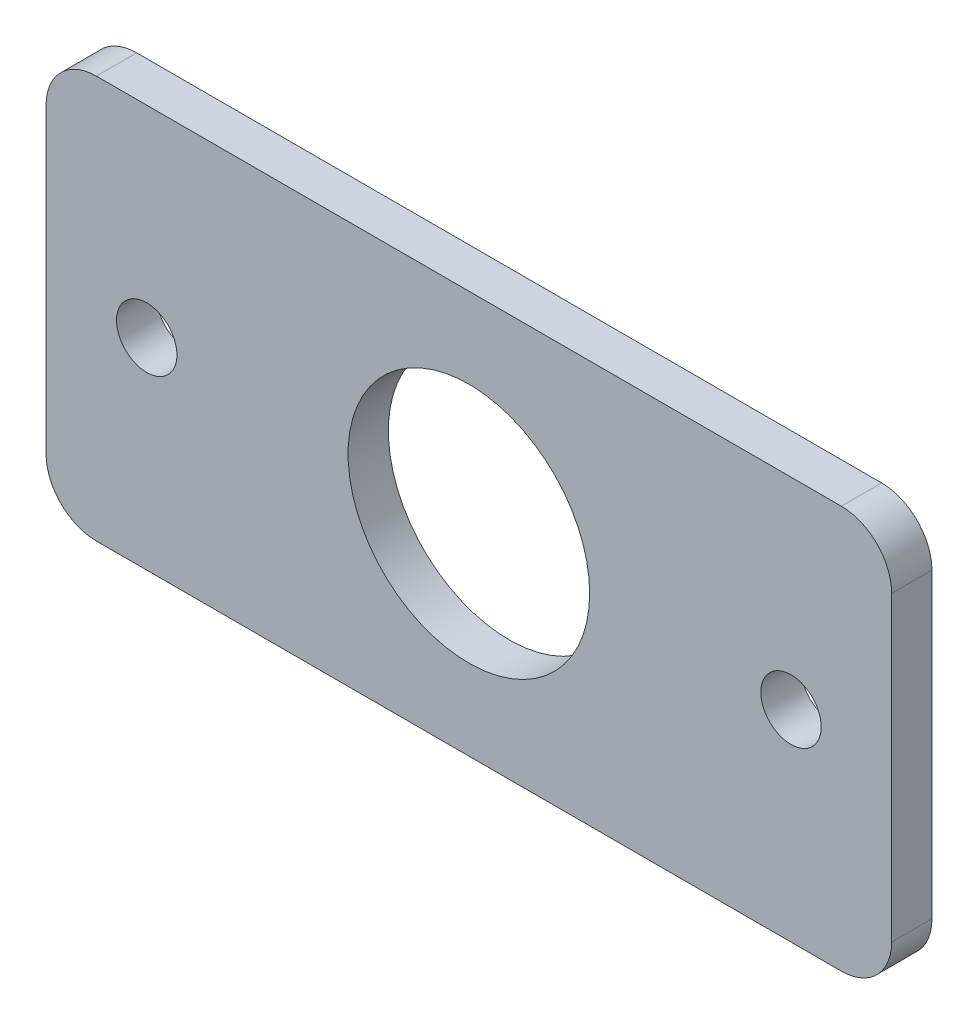
ISO-10303-21;
HEADER;
FILE_DESCRIPTION(('STEP AP214'),'2;1');
FILE_NAME('part.step','',(''),(''),'','','');
FILE_SCHEMA(('AUTOMOTIVE_DESIGN { 1 0 10303 214 1 1 1 1 }'));
ENDSEC;
DATA;
#1=APPLICATION_CONTEXT('core data for automotive mechanical design processes');
#2=APPLICATION_PROTOCOL_DEFINITION('international standard','automotive_design',2000,#1);
#3=PRODUCT_CONTEXT('',#1,'mechanical');
#4=PRODUCT('Part','Part','',(#3));
#5=PRODUCT_RELATED_PRODUCT_CATEGORY('part','',(#4));
#6=PRODUCT_DEFINITION_FORMATION('','',#4);
#7=PRODUCT_DEFINITION_CONTEXT('part definition',#1,'design');
#8=PRODUCT_DEFINITION('design','',#6,#7);
#9=PRODUCT_DEFINITION_SHAPE('','',#8);
#10=(LENGTH_UNIT() NAMED_UNIT(*) SI_UNIT(.MILLI.,.METRE.));
#11=(NAMED_UNIT(*) PLANE_ANGLE_UNIT() SI_UNIT($,.RADIAN.));
#12=(NAMED_UNIT(*) SI_UNIT($,.STERADIAN.) SOLID_ANGLE_UNIT());
#13=UNCERTAINTY_MEASURE_WITH_UNIT(LENGTH_MEASURE(1.E-05),#10,'distance_accuracy_value','');
#14=(GEOMETRIC_REPRESENTATION_CONTEXT(3) GLOBAL_UNCERTAINTY_ASSIGNED_CONTEXT((#13)) GLOBAL_UNIT_ASSIGNED_CONTEXT((#10,
#11,#12)) REPRESENTATION_CONTEXT('',''));
#15=CARTESIAN_POINT('',(0.,0.,0.));
#16=DIRECTION('',(0.,0.,1.));
#17=DIRECTION('',(1.,0.,0.));
#18=AXIS2_PLACEMENT_3D('',#15,#16,#17);
#19=CARTESIAN_POINT('',(-18.5,2.5,2.));
#20=DIRECTION('',(0.,0.,1.));
#21=DIRECTION('',(1.,0.,0.));
#22=AXIS2_PLACEMENT_3D('',#19,#20,#21);
#23=PLANE('',#22);
#24=CARTESIAN_POINT('',(-16.,10.,2.));
#25=DIRECTION('',(0.,0.,1.));
#26=DIRECTION('',(-1.,0.,0.));
#27=AXIS2_PLACEMENT_3D('',#24,#25,#26);
#28=CIRCLE('',#27,1.5);
#29=CARTESIAN_POINT('',(-17.5,10.,2.));
#30=VERTEX_POINT('',#29);
#31=EDGE_CURVE('E182',#30,#30,#28,.T.);
#32=ORIENTED_EDGE('',*,*,#31,.F.);
#33=EDGE_LOOP('',(#32));
#34=FACE_BOUND('',#33,.T.);
#35=CARTESIAN_POINT('',(-18.5,2.5,2.));
#36=DIRECTION('',(0.,0.,1.));
#37=DIRECTION('',(1.,0.,0.));
#38=AXIS2_PLACEMENT_3D('',#35,#36,#37);
#39=CIRCLE('',#38,2.5);
#40=CARTESIAN_POINT('',(-21.,2.5,2.));
#41=VERTEX_POINT('',#40);
#42=CARTESIAN_POINT('',(-18.5,0.,2.));
#43=VERTEX_POINT('',#42);
#44=EDGE_CURVE('E145',#41,#43,#39,.T.);
#45=ORIENTED_EDGE('',*,*,#44,.T.);
#46=DIRECTION('',(1.,0.,0.));
#47=VECTOR('',#46,1.);
#48=CARTESIAN_POINT('',(-18.5,0.,2.));
#49=LINE('',#48,#47);
#50=CARTESIAN_POINT('',(18.5,0.,2.));
#51=VERTEX_POINT('',#50);
#52=EDGE_CURVE('E93',#43,#51,#49,.T.);
#53=ORIENTED_EDGE('',*,*,#52,.T.);
#54=CARTESIAN_POINT('',(18.5,2.5,2.));
#55=DIRECTION('',(0.,0.,1.));
#56=DIRECTION('',(1.,0.,0.));
#57=AXIS2_PLACEMENT_3D('',#54,#55,#56);
#58=CIRCLE('',#57,2.5);
#59=CARTESIAN_POINT('',(21.,2.5,2.));
#60=VERTEX_POINT('',#59);
#61=EDGE_CURVE('E160',#51,#60,#58,.T.);
#62=ORIENTED_EDGE('',*,*,#61,.T.);
#63=DIRECTION('',(0.,1.,0.));
#64=VECTOR('',#63,1.);
#65=CARTESIAN_POINT('',(21.,17.5,2.));
#66=LINE('',#65,#64);
#67=CARTESIAN_POINT('',(21.,17.5,2.));
#68=VERTEX_POINT('',#67);
#69=EDGE_CURVE('E173',#60,#68,#66,.T.);
#70=ORIENTED_EDGE('',*,*,#69,.T.);
#71=CARTESIAN_POINT('',(18.5,17.5,2.));
#72=DIRECTION('',(0.,0.,1.));
#73=DIRECTION('',(1.,0.,0.));
#74=AXIS2_PLACEMENT_3D('',#71,#72,#73);
#75=CIRCLE('',#74,2.5);
#76=CARTESIAN_POINT('',(18.5,20.,2.));
#77=VERTEX_POINT('',#76);
#78=EDGE_CURVE('E112',#68,#77,#75,.T.);
#79=ORIENTED_EDGE('',*,*,#78,.T.);
#80=DIRECTION('',(-1.,0.,0.));
#81=VECTOR('',#80,1.);
#82=CARTESIAN_POINT('',(-18.5,20.,2.));
#83=LINE('',#82,#81);
#84=CARTESIAN_POINT('',(-18.5,20.,2.));
#85=VERTEX_POINT('',#84);
#86=EDGE_CURVE('E106',#77,#85,#83,.T.);
#87=ORIENTED_EDGE('',*,*,#86,.T.);
#88=CARTESIAN_POINT('',(-18.5,17.5,2.));
#89=DIRECTION('',(0.,0.,1.));
#90=DIRECTION('',(1.,0.,0.));
#91=AXIS2_PLACEMENT_3D('',#88,#89,#90);
#92=CIRCLE('',#91,2.5);
#93=CARTESIAN_POINT('',(-21.,17.5,2.));
#94=VERTEX_POINT('',#93);
#95=EDGE_CURVE('E110',#85,#94,#92,.T.);
#96=ORIENTED_EDGE('',*,*,#95,.T.);
#97=DIRECTION('',(0.,-1.,0.));
#98=VECTOR('',#97,1.);
#99=CARTESIAN_POINT('',(-21.,17.5,2.));
#100=LINE('',#99,#98);
#101=EDGE_CURVE('E50',#94,#41,#100,.T.);
#102=ORIENTED_EDGE('',*,*,#101,.T.);
#103=EDGE_LOOP('',(#45,#53,#62,#70,#79,#87,#96,#102));
#104=FACE_BOUND('',#103,.T.);
#105=CARTESIAN_POINT('',(16.,10.,2.));
#106=DIRECTION('',(0.,0.,1.));
#107=DIRECTION('',(1.,0.,0.));
#108=AXIS2_PLACEMENT_3D('',#105,#106,#107);
#109=CIRCLE('',#108,1.5);
#110=CARTESIAN_POINT('',(17.5,10.,2.));
#111=VERTEX_POINT('',#110);
#112=EDGE_CURVE('E134',#111,#111,#109,.T.);
#113=ORIENTED_EDGE('',*,*,#112,.F.);
#114=EDGE_LOOP('',(#113));
#115=FACE_BOUND('',#114,.T.);
#116=CARTESIAN_POINT('',(0.,10.,2.));
#117=DIRECTION('',(0.,0.,1.));
#118=DIRECTION('',(1.,0.,0.));
#119=AXIS2_PLACEMENT_3D('',#116,#117,#118);
#120=CIRCLE('',#119,6.);
#121=CARTESIAN_POINT('',(6.,10.,2.));
#122=VERTEX_POINT('',#121);
#123=EDGE_CURVE('E188',#122,#122,#120,.T.);
#124=ORIENTED_EDGE('',*,*,#123,.F.);
#125=EDGE_LOOP('',(#124));
#126=FACE_BOUND('',#125,.T.);
#127=ADVANCED_FACE('F33',(#34,#104,#115,#126),#23,.T.);
#128=CARTESIAN_POINT('',(-18.5,2.5,0.));
#129=DIRECTION('',(0.,0.,1.));
#130=DIRECTION('',(1.,0.,0.));
#131=AXIS2_PLACEMENT_3D('',#128,#129,#130);
#132=PLANE('',#131);
#133=CARTESIAN_POINT('',(-18.5,2.5,0.));
#134=DIRECTION('',(0.,0.,1.));
#135=DIRECTION('',(1.,0.,0.));
#136=AXIS2_PLACEMENT_3D('',#133,#134,#135);
#137=CIRCLE('',#136,2.5);
#138=CARTESIAN_POINT('',(-21.,2.5,0.));
#139=VERTEX_POINT('',#138);
#140=CARTESIAN_POINT('',(-18.5,0.,0.));
#141=VERTEX_POINT('',#140);
#142=EDGE_CURVE('E130',#139,#141,#137,.T.);
#143=ORIENTED_EDGE('',*,*,#142,.F.);
#144=DIRECTION('',(0.,-1.,0.));
#145=VECTOR('',#144,1.);
#146=CARTESIAN_POINT('',(-21.,17.5,0.));
#147=LINE('',#146,#145);
#148=CARTESIAN_POINT('',(-21.,17.5,0.));
#149=VERTEX_POINT('',#148);
#150=EDGE_CURVE('E85',#149,#139,#147,.T.);
#151=ORIENTED_EDGE('',*,*,#150,.F.);
#152=CARTESIAN_POINT('',(-18.5,17.5,0.));
#153=DIRECTION('',(0.,0.,1.));
#154=DIRECTION('',(1.,0.,0.));
#155=AXIS2_PLACEMENT_3D('',#152,#153,#154);
#156=CIRCLE('',#155,2.5);
#157=CARTESIAN_POINT('',(-18.5,20.,0.));
#158=VERTEX_POINT('',#157);
#159=EDGE_CURVE('E79',#158,#149,#156,.T.);
#160=ORIENTED_EDGE('',*,*,#159,.F.);
#161=DIRECTION('',(-1.,0.,0.));
#162=VECTOR('',#161,1.);
#163=CARTESIAN_POINT('',(-18.5,20.,0.));
#164=LINE('',#163,#162);
#165=CARTESIAN_POINT('',(18.5,20.,0.));
#166=VERTEX_POINT('',#165);
#167=EDGE_CURVE('E120',#166,#158,#164,.T.);
#168=ORIENTED_EDGE('',*,*,#167,.F.);
#169=CARTESIAN_POINT('',(18.5,17.5,0.));
#170=DIRECTION('',(0.,0.,1.));
#171=DIRECTION('',(1.,0.,0.));
#172=AXIS2_PLACEMENT_3D('',#169,#170,#171);
#173=CIRCLE('',#172,2.5);
#174=CARTESIAN_POINT('',(21.,17.5,0.));
#175=VERTEX_POINT('',#174);
#176=EDGE_CURVE('E140',#175,#166,#173,.T.);
#177=ORIENTED_EDGE('',*,*,#176,.F.);
#178=DIRECTION('',(0.,1.,0.));
#179=VECTOR('',#178,1.);
#180=CARTESIAN_POINT('',(21.,17.5,0.));
#181=LINE('',#180,#179);
#182=CARTESIAN_POINT('',(21.,2.5,0.));
#183=VERTEX_POINT('',#182);
#184=EDGE_CURVE('E138',#183,#175,#181,.T.);
#185=ORIENTED_EDGE('',*,*,#184,.F.);
#186=CARTESIAN_POINT('',(18.5,2.5,0.));
#187=DIRECTION('',(0.,0.,1.));
#188=DIRECTION('',(1.,0.,0.));
#189=AXIS2_PLACEMENT_3D('',#186,#187,#188);
#190=CIRCLE('',#189,2.5);
#191=CARTESIAN_POINT('',(18.5,0.,0.));
#192=VERTEX_POINT('',#191);
#193=EDGE_CURVE('E136',#192,#183,#190,.T.);
#194=ORIENTED_EDGE('',*,*,#193,.F.);
#195=DIRECTION('',(1.,0.,0.));
#196=VECTOR('',#195,1.);
#197=CARTESIAN_POINT('',(-18.5,0.,0.));
#198=LINE('',#197,#196);
#199=EDGE_CURVE('E133',#141,#192,#198,.T.);
#200=ORIENTED_EDGE('',*,*,#199,.F.);
#201=EDGE_LOOP('',(#143,#151,#160,#168,#177,#185,#194,#200));
#202=FACE_BOUND('',#201,.T.);
#203=CARTESIAN_POINT('',(16.,10.,0.));
#204=DIRECTION('',(0.,0.,1.));
#205=DIRECTION('',(1.,0.,0.));
#206=AXIS2_PLACEMENT_3D('',#203,#204,#205);
#207=CIRCLE('',#206,1.5);
#208=CARTESIAN_POINT('',(17.5,10.,0.));
#209=VERTEX_POINT('',#208);
#210=EDGE_CURVE('E179',#209,#209,#207,.T.);
#211=ORIENTED_EDGE('',*,*,#210,.T.);
#212=EDGE_LOOP('',(#211));
#213=FACE_BOUND('',#212,.T.);
#214=CARTESIAN_POINT('',(-16.,10.,0.));
#215=DIRECTION('',(0.,0.,1.));
#216=DIRECTION('',(-1.,0.,0.));
#217=AXIS2_PLACEMENT_3D('',#214,#215,#216);
#218=CIRCLE('',#217,1.5);
#219=CARTESIAN_POINT('',(-17.5,10.,0.));
#220=VERTEX_POINT('',#219);
#221=EDGE_CURVE('E185',#220,#220,#218,.T.);
#222=ORIENTED_EDGE('',*,*,#221,.T.);
#223=EDGE_LOOP('',(#222));
#224=FACE_BOUND('',#223,.T.);
#225=CARTESIAN_POINT('',(0.,10.,0.));
#226=DIRECTION('',(0.,0.,1.));
#227=DIRECTION('',(1.,0.,0.));
#228=AXIS2_PLACEMENT_3D('',#225,#226,#227);
#229=CIRCLE('',#228,6.);
#230=CARTESIAN_POINT('',(6.,10.,0.));
#231=VERTEX_POINT('',#230);
#232=EDGE_CURVE('E191',#231,#231,#229,.T.);
#233=ORIENTED_EDGE('',*,*,#232,.T.);
#234=EDGE_LOOP('',(#233));
#235=FACE_BOUND('',#234,.T.);
#236=ADVANCED_FACE('F164',(#202,#213,#224,#235),#132,.F.);
#237=CARTESIAN_POINT('',(-18.5,2.5,2.));
#238=DIRECTION('',(0.,0.,-1.));
#239=DIRECTION('',(-1.,0.,0.));
#240=AXIS2_PLACEMENT_3D('',#237,#238,#239);
#241=CYLINDRICAL_SURFACE('',#240,2.5);
#242=ORIENTED_EDGE('',*,*,#142,.T.);
#243=DIRECTION('',(0.,0.,-1.));
#244=VECTOR('',#243,1.);
#245=CARTESIAN_POINT('',(-18.5,0.,2.));
#246=LINE('',#245,#244);
#247=EDGE_CURVE('E11',#43,#141,#246,.T.);
#248=ORIENTED_EDGE('',*,*,#247,.F.);
#249=ORIENTED_EDGE('',*,*,#44,.F.);
#250=DIRECTION('',(0.,0.,-1.));
#251=VECTOR('',#250,1.);
#252=CARTESIAN_POINT('',(-21.,2.5,2.));
#253=LINE('',#252,#251);
#254=EDGE_CURVE('E126',#41,#139,#253,.T.);
#255=ORIENTED_EDGE('',*,*,#254,.T.);
#256=EDGE_LOOP('',(#242,#248,#249,#255));
#257=FACE_BOUND('',#256,.T.);
#258=ADVANCED_FACE('F35',(#257),#241,.T.);
#259=CARTESIAN_POINT('',(-18.5,0.,2.));
#260=DIRECTION('',(0.,1.,0.));
#261=DIRECTION('',(0.,0.,1.));
#262=AXIS2_PLACEMENT_3D('',#259,#260,#261);
#263=PLANE('',#262);
#264=ORIENTED_EDGE('',*,*,#199,.T.);
#265=DIRECTION('',(0.,0.,-1.));
#266=VECTOR('',#265,1.);
#267=CARTESIAN_POINT('',(18.5,0.,2.));
#268=LINE('',#267,#266);
#269=EDGE_CURVE('E42',#51,#192,#268,.T.);
#270=ORIENTED_EDGE('',*,*,#269,.F.);
#271=ORIENTED_EDGE('',*,*,#52,.F.);
#272=ORIENTED_EDGE('',*,*,#247,.T.);
#273=EDGE_LOOP('',(#264,#270,#271,#272));
#274=FACE_BOUND('',#273,.T.);
#275=ADVANCED_FACE('F224',(#274),#263,.F.);
#276=CARTESIAN_POINT('',(18.5,2.5,2.));
#277=DIRECTION('',(0.,0.,-1.));
#278=DIRECTION('',(-1.,0.,0.));
#279=AXIS2_PLACEMENT_3D('',#276,#277,#278);
#280=CYLINDRICAL_SURFACE('',#279,2.5);
#281=ORIENTED_EDGE('',*,*,#193,.T.);
#282=DIRECTION('',(0.,0.,-1.));
#283=VECTOR('',#282,1.);
#284=CARTESIAN_POINT('',(21.,2.5,2.));
#285=LINE('',#284,#283);
#286=EDGE_CURVE('E152',#60,#183,#285,.T.);
#287=ORIENTED_EDGE('',*,*,#286,.F.);
#288=ORIENTED_EDGE('',*,*,#61,.F.);
#289=ORIENTED_EDGE('',*,*,#269,.T.);
#290=EDGE_LOOP('',(#281,#287,#288,#289));
#291=FACE_BOUND('',#290,.T.);
#292=ADVANCED_FACE('F158',(#291),#280,.T.);
#293=CARTESIAN_POINT('',(21.,17.5,2.));
#294=DIRECTION('',(-1.,0.,0.));
#295=DIRECTION('',(0.,0.,1.));
#296=AXIS2_PLACEMENT_3D('',#293,#294,#295);
#297=PLANE('',#296);
#298=ORIENTED_EDGE('',*,*,#184,.T.);
#299=DIRECTION('',(0.,0.,-1.));
#300=VECTOR('',#299,1.);
#301=CARTESIAN_POINT('',(21.,17.5,2.));
#302=LINE('',#301,#300);
#303=EDGE_CURVE('E149',#68,#175,#302,.T.);
#304=ORIENTED_EDGE('',*,*,#303,.F.);
#305=ORIENTED_EDGE('',*,*,#69,.F.);
#306=ORIENTED_EDGE('',*,*,#286,.T.);
#307=EDGE_LOOP('',(#298,#304,#305,#306));
#308=FACE_BOUND('',#307,.T.);
#309=ADVANCED_FACE('F169',(#308),#297,.F.);
#310=CARTESIAN_POINT('',(18.5,17.5,2.));
#311=DIRECTION('',(0.,0.,-1.));
#312=DIRECTION('',(-1.,0.,0.));
#313=AXIS2_PLACEMENT_3D('',#310,#311,#312);
#314=CYLINDRICAL_SURFACE('',#313,2.5);
#315=ORIENTED_EDGE('',*,*,#176,.T.);
#316=DIRECTION('',(0.,0.,-1.));
#317=VECTOR('',#316,1.);
#318=CARTESIAN_POINT('',(18.5,20.,2.));
#319=LINE('',#318,#317);
#320=EDGE_CURVE('E121',#77,#166,#319,.T.);
#321=ORIENTED_EDGE('',*,*,#320,.F.);
#322=ORIENTED_EDGE('',*,*,#78,.F.);
#323=ORIENTED_EDGE('',*,*,#303,.T.);
#324=EDGE_LOOP('',(#315,#321,#322,#323));
#325=FACE_BOUND('',#324,.T.);
#326=ADVANCED_FACE('F172',(#325),#314,.T.);
#327=CARTESIAN_POINT('',(-18.5,20.,2.));
#328=DIRECTION('',(0.,-1.,0.));
#329=DIRECTION('',(0.,0.,-1.));
#330=AXIS2_PLACEMENT_3D('',#327,#328,#329);
#331=PLANE('',#330);
#332=ORIENTED_EDGE('',*,*,#167,.T.);
#333=DIRECTION('',(0.,0.,-1.));
#334=VECTOR('',#333,1.);
#335=CARTESIAN_POINT('',(-18.5,20.,2.));
#336=LINE('',#335,#334);
#337=EDGE_CURVE('E117',#85,#158,#336,.T.);
#338=ORIENTED_EDGE('',*,*,#337,.F.);
#339=ORIENTED_EDGE('',*,*,#86,.F.);
#340=ORIENTED_EDGE('',*,*,#320,.T.);
#341=EDGE_LOOP('',(#332,#338,#339,#340));
#342=FACE_BOUND('',#341,.T.);
#343=ADVANCED_FACE('F118',(#342),#331,.F.);
#344=CARTESIAN_POINT('',(-18.5,17.5,2.));
#345=DIRECTION('',(0.,0.,-1.));
#346=DIRECTION('',(-1.,0.,0.));
#347=AXIS2_PLACEMENT_3D('',#344,#345,#346);
#348=CYLINDRICAL_SURFACE('',#347,2.5);
#349=ORIENTED_EDGE('',*,*,#159,.T.);
#350=DIRECTION('',(0.,0.,-1.));
#351=VECTOR('',#350,1.);
#352=CARTESIAN_POINT('',(-21.,17.5,2.));
#353=LINE('',#352,#351);
#354=EDGE_CURVE('E122',#94,#149,#353,.T.);
#355=ORIENTED_EDGE('',*,*,#354,.F.);
#356=ORIENTED_EDGE('',*,*,#95,.F.);
#357=ORIENTED_EDGE('',*,*,#337,.T.);
#358=EDGE_LOOP('',(#349,#355,#356,#357));
#359=FACE_BOUND('',#358,.T.);
#360=ADVANCED_FACE('F124',(#359),#348,.T.);
#361=CARTESIAN_POINT('',(-21.,17.5,2.));
#362=DIRECTION('',(1.,0.,0.));
#363=DIRECTION('',(0.,0.,-1.));
#364=AXIS2_PLACEMENT_3D('',#361,#362,#363);
#365=PLANE('',#364);
#366=ORIENTED_EDGE('',*,*,#150,.T.);
#367=ORIENTED_EDGE('',*,*,#254,.F.);
#368=ORIENTED_EDGE('',*,*,#101,.F.);
#369=ORIENTED_EDGE('',*,*,#354,.T.);
#370=EDGE_LOOP('',(#366,#367,#368,#369));
#371=FACE_BOUND('',#370,.T.);
#372=ADVANCED_FACE('F212',(#371),#365,.F.);
#373=CARTESIAN_POINT('',(16.,10.,2.));
#374=DIRECTION('',(0.,0.,-1.));
#375=DIRECTION('',(-1.,0.,0.));
#376=AXIS2_PLACEMENT_3D('',#373,#374,#375);
#377=CYLINDRICAL_SURFACE('',#376,1.5);
#378=ORIENTED_EDGE('',*,*,#112,.T.);
#379=EDGE_LOOP('',(#378));
#380=FACE_BOUND('',#379,.T.);
#381=ORIENTED_EDGE('',*,*,#210,.F.);
#382=EDGE_LOOP('',(#381));
#383=FACE_BOUND('',#382,.T.);
#384=ADVANCED_FACE('F209',(#380,#383),#377,.F.);
#385=CARTESIAN_POINT('',(-16.,10.,2.));
#386=DIRECTION('',(0.,0.,-1.));
#387=DIRECTION('',(-1.,0.,0.));
#388=AXIS2_PLACEMENT_3D('',#385,#386,#387);
#389=CYLINDRICAL_SURFACE('',#388,1.5);
#390=ORIENTED_EDGE('',*,*,#31,.T.);
#391=EDGE_LOOP('',(#390));
#392=FACE_BOUND('',#391,.T.);
#393=ORIENTED_EDGE('',*,*,#221,.F.);
#394=EDGE_LOOP('',(#393));
#395=FACE_BOUND('',#394,.T.);
#396=ADVANCED_FACE('F288',(#392,#395),#389,.F.);
#397=CARTESIAN_POINT('',(0.,10.,2.));
#398=DIRECTION('',(0.,0.,-1.));
#399=DIRECTION('',(-1.,0.,0.));
#400=AXIS2_PLACEMENT_3D('',#397,#398,#399);
#401=CYLINDRICAL_SURFACE('',#400,6.);
#402=ORIENTED_EDGE('',*,*,#123,.T.);
#403=EDGE_LOOP('',(#402));
#404=FACE_BOUND('',#403,.T.);
#405=ORIENTED_EDGE('',*,*,#232,.F.);
#406=EDGE_LOOP('',(#405));
#407=FACE_BOUND('',#406,.T.);
#408=ADVANCED_FACE('F197',(#404,#407),#401,.F.);
#409=CLOSED_SHELL('',(#127,#236,#258,#275,#292,#309,#326,#343,#360,#372,#384,#396,#408));
#410=MANIFOLD_SOLID_BREP('B2',#409);
#411=ADVANCED_BREP_SHAPE_REPRESENTATION('',(#18,#410),#14);
#412=SHAPE_DEFINITION_REPRESENTATION(#9,#411);
ENDSEC;
END-ISO-10303-21;
